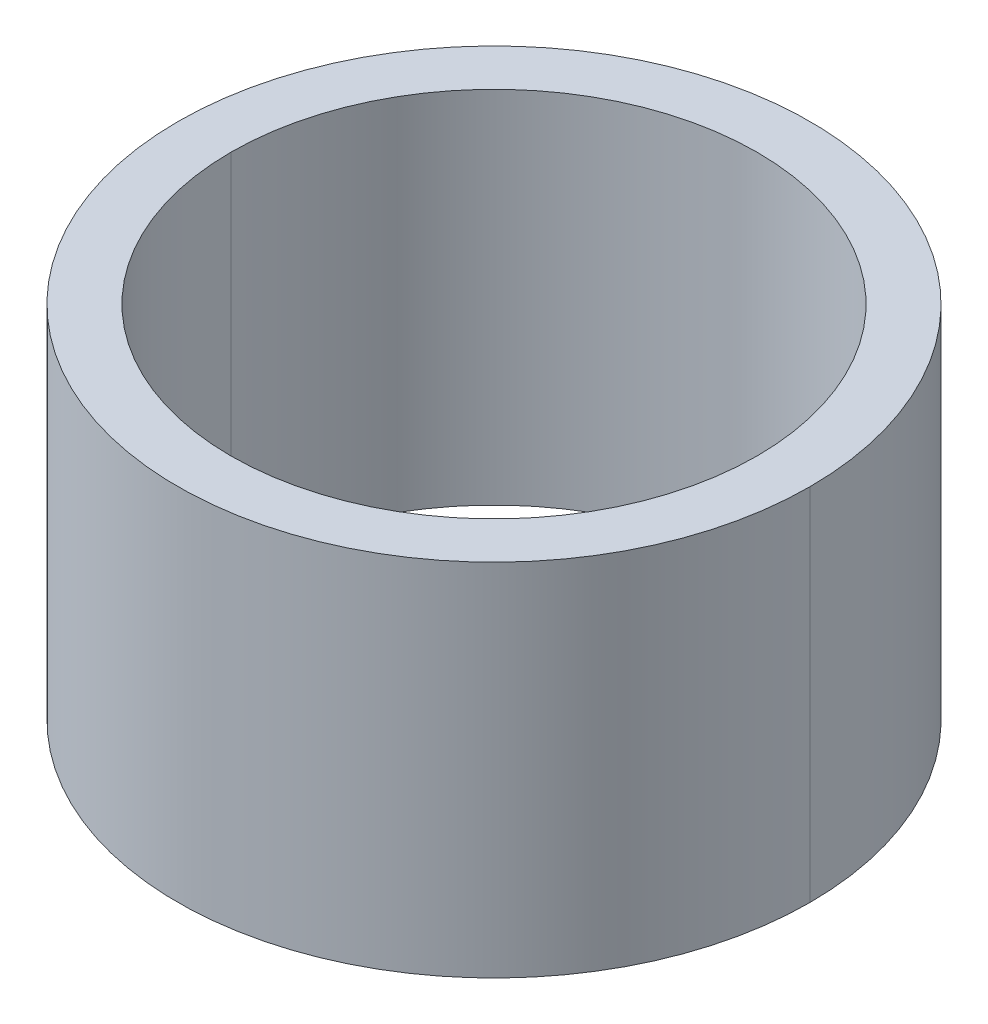
ISO-10303-21;
HEADER;
FILE_DESCRIPTION(('STEP AP214'),'2;1');
FILE_NAME('part.step','',(''),(''),'','','');
FILE_SCHEMA(('AUTOMOTIVE_DESIGN { 1 0 10303 214 1 1 1 1 }'));
ENDSEC;
DATA;
#1=APPLICATION_CONTEXT('core data for automotive mechanical design processes');
#2=APPLICATION_PROTOCOL_DEFINITION('international standard','automotive_design',2000,#1);
#3=PRODUCT_CONTEXT('',#1,'mechanical');
#4=PRODUCT('Part','Part','',(#3));
#5=PRODUCT_RELATED_PRODUCT_CATEGORY('part','',(#4));
#6=PRODUCT_DEFINITION_FORMATION('','',#4);
#7=PRODUCT_DEFINITION_CONTEXT('part definition',#1,'design');
#8=PRODUCT_DEFINITION('design','',#6,#7);
#9=PRODUCT_DEFINITION_SHAPE('','',#8);
#10=(LENGTH_UNIT() NAMED_UNIT(*) SI_UNIT(.MILLI.,.METRE.));
#11=(NAMED_UNIT(*) PLANE_ANGLE_UNIT() SI_UNIT($,.RADIAN.));
#12=(NAMED_UNIT(*) SI_UNIT($,.STERADIAN.) SOLID_ANGLE_UNIT());
#13=UNCERTAINTY_MEASURE_WITH_UNIT(LENGTH_MEASURE(1.E-05),#10,'distance_accuracy_value','');
#14=(GEOMETRIC_REPRESENTATION_CONTEXT(3) GLOBAL_UNCERTAINTY_ASSIGNED_CONTEXT((#13)) GLOBAL_UNIT_ASSIGNED_CONTEXT((#10,
#11,#12)) REPRESENTATION_CONTEXT('',''));
#15=CARTESIAN_POINT('',(0.,0.,0.));
#16=DIRECTION('',(0.,0.,1.));
#17=DIRECTION('',(1.,0.,0.));
#18=AXIS2_PLACEMENT_3D('',#15,#16,#17);
#19=CARTESIAN_POINT('',(94.2227877115227,66.7433443998357,55.5323900599142));
#20=DIRECTION('',(0.,1.,0.));
#21=DIRECTION('',(1.,0.,0.));
#22=AXIS2_PLACEMENT_3D('',#19,#20,#21);
#23=PLANE('',#22);
#24=CARTESIAN_POINT('',(94.2227877115227,66.7433443998357,55.532390059914));
#25=DIRECTION('',(0.,-1.,0.));
#26=DIRECTION('',(1.,0.,0.));
#27=AXIS2_PLACEMENT_3D('',#24,#25,#26);
#28=CIRCLE('',#27,0.803595977519237);
#29=CARTESIAN_POINT('',(93.4191917340035,66.7433443998357,55.532390059914));
#30=VERTEX_POINT('',#29);
#31=CARTESIAN_POINT('',(95.0263836890419,66.7433443998357,55.532390059914));
#32=VERTEX_POINT('',#31);
#33=EDGE_CURVE('E11',#30,#32,#28,.T.);
#34=ORIENTED_EDGE('',*,*,#33,.F.);
#35=CARTESIAN_POINT('',(94.2227877115227,66.7433443998357,55.532390059914));
#36=DIRECTION('',(0.,-1.,0.));
#37=DIRECTION('',(1.,0.,0.));
#38=AXIS2_PLACEMENT_3D('',#35,#36,#37);
#39=CIRCLE('',#38,0.803595977519237);
#40=EDGE_CURVE('E83',#32,#30,#39,.T.);
#41=ORIENTED_EDGE('',*,*,#40,.F.);
#42=EDGE_LOOP('',(#34,#41));
#43=FACE_BOUND('',#42,.T.);
#44=CARTESIAN_POINT('',(94.2227877115227,66.7433443998357,55.5323900599142));
#45=DIRECTION('',(0.,1.,0.));
#46=DIRECTION('',(1.,0.,0.));
#47=AXIS2_PLACEMENT_3D('',#44,#45,#46);
#48=CIRCLE('',#47,0.965609835942224);
#49=CARTESIAN_POINT('',(93.2571778755805,66.7433443998357,55.5323900599142));
#50=VERTEX_POINT('',#49);
#51=CARTESIAN_POINT('',(95.1883975474649,66.7433443998357,55.5323900599142));
#52=VERTEX_POINT('',#51);
#53=EDGE_CURVE('E35',#50,#52,#48,.T.);
#54=ORIENTED_EDGE('',*,*,#53,.F.);
#55=CARTESIAN_POINT('',(94.2227877115227,66.7433443998357,55.5323900599142));
#56=DIRECTION('',(0.,1.,0.));
#57=DIRECTION('',(1.,0.,0.));
#58=AXIS2_PLACEMENT_3D('',#55,#56,#57);
#59=CIRCLE('',#58,0.965609835942224);
#60=EDGE_CURVE('E106',#52,#50,#59,.T.);
#61=ORIENTED_EDGE('',*,*,#60,.F.);
#62=EDGE_LOOP('',(#54,#61));
#63=FACE_BOUND('',#62,.T.);
#64=ADVANCED_FACE('F16',(#43,#63),#23,.F.);
#65=CARTESIAN_POINT('',(94.2227877115227,67.8433443998357,55.5323900599142));
#66=DIRECTION('',(0.,1.,0.));
#67=DIRECTION('',(1.,0.,0.));
#68=AXIS2_PLACEMENT_3D('',#65,#66,#67);
#69=PLANE('',#68);
#70=CARTESIAN_POINT('',(94.2227877115227,67.8433443998357,55.532390059914));
#71=DIRECTION('',(0.,-1.,0.));
#72=DIRECTION('',(0.,0.,1.));
#73=AXIS2_PLACEMENT_3D('',#70,#71,#72);
#74=CIRCLE('',#73,0.803595977519237);
#75=CARTESIAN_POINT('',(93.4191917340035,67.8433443998357,55.532390059914));
#76=VERTEX_POINT('',#75);
#77=CARTESIAN_POINT('',(95.0263836890419,67.8433443998357,55.532390059914));
#78=VERTEX_POINT('',#77);
#79=EDGE_CURVE('E19',#76,#78,#74,.T.);
#80=ORIENTED_EDGE('',*,*,#79,.T.);
#81=CARTESIAN_POINT('',(94.2227877115227,67.8433443998357,55.532390059914));
#82=DIRECTION('',(0.,-1.,0.));
#83=DIRECTION('',(0.,0.,1.));
#84=AXIS2_PLACEMENT_3D('',#81,#82,#83);
#85=CIRCLE('',#84,0.803595977519237);
#86=EDGE_CURVE('E71',#78,#76,#85,.T.);
#87=ORIENTED_EDGE('',*,*,#86,.T.);
#88=EDGE_LOOP('',(#80,#87));
#89=FACE_BOUND('',#88,.T.);
#90=CARTESIAN_POINT('',(94.2227877115227,67.8433443998357,55.5323900599142));
#91=DIRECTION('',(0.,1.,0.));
#92=DIRECTION('',(0.,0.,1.));
#93=AXIS2_PLACEMENT_3D('',#90,#91,#92);
#94=CIRCLE('',#93,0.965609835942231);
#95=CARTESIAN_POINT('',(93.2571778755805,67.8433443998357,55.5323900599142));
#96=VERTEX_POINT('',#95);
#97=CARTESIAN_POINT('',(95.1883975474649,67.8433443998357,55.5323900599142));
#98=VERTEX_POINT('',#97);
#99=EDGE_CURVE('E102',#96,#98,#94,.T.);
#100=ORIENTED_EDGE('',*,*,#99,.T.);
#101=CARTESIAN_POINT('',(94.2227877115227,67.8433443998357,55.5323900599142));
#102=DIRECTION('',(0.,1.,0.));
#103=DIRECTION('',(0.,0.,1.));
#104=AXIS2_PLACEMENT_3D('',#101,#102,#103);
#105=CIRCLE('',#104,0.965609835942231);
#106=EDGE_CURVE('E95',#98,#96,#105,.T.);
#107=ORIENTED_EDGE('',*,*,#106,.T.);
#108=EDGE_LOOP('',(#100,#107));
#109=FACE_BOUND('',#108,.T.);
#110=ADVANCED_FACE('F68',(#89,#109),#69,.T.);
#111=CARTESIAN_POINT('',(94.2227877115227,67.7433443998357,55.532390059914));
#112=DIRECTION('',(0.,-1.,0.));
#113=DIRECTION('',(-1.,0.,0.));
#114=AXIS2_PLACEMENT_3D('',#111,#112,#113);
#115=CYLINDRICAL_SURFACE('',#114,0.803595977519237);
#116=DIRECTION('',(0.,-1.,0.));
#117=VECTOR('',#116,1.);
#118=CARTESIAN_POINT('',(95.0263836890419,67.7433443998357,55.532390059914));
#119=LINE('',#118,#117);
#120=EDGE_CURVE('E77',#78,#32,#119,.T.);
#121=ORIENTED_EDGE('',*,*,#120,.F.);
#122=ORIENTED_EDGE('',*,*,#79,.F.);
#123=DIRECTION('',(0.,-1.,0.));
#124=VECTOR('',#123,1.);
#125=CARTESIAN_POINT('',(93.4191917340035,67.7433443998357,55.532390059914));
#126=LINE('',#125,#124);
#127=EDGE_CURVE('E86',#76,#30,#126,.T.);
#128=ORIENTED_EDGE('',*,*,#127,.T.);
#129=ORIENTED_EDGE('',*,*,#33,.T.);
#130=EDGE_LOOP('',(#121,#122,#128,#129));
#131=FACE_BOUND('',#130,.T.);
#132=ADVANCED_FACE('F78',(#131),#115,.F.);
#133=CARTESIAN_POINT('',(94.2227877115227,67.7433443998357,55.5323900599142));
#134=DIRECTION('',(0.,-1.,0.));
#135=DIRECTION('',(-1.,0.,0.));
#136=AXIS2_PLACEMENT_3D('',#133,#134,#135);
#137=CYLINDRICAL_SURFACE('',#136,0.965609835942224);
#138=DIRECTION('',(0.,-1.,0.));
#139=VECTOR('',#138,1.);
#140=CARTESIAN_POINT('',(95.1883975474649,67.7433443998357,55.5323900599142));
#141=LINE('',#140,#139);
#142=EDGE_CURVE('E99',#98,#52,#141,.T.);
#143=ORIENTED_EDGE('',*,*,#142,.F.);
#144=ORIENTED_EDGE('',*,*,#99,.F.);
#145=DIRECTION('',(0.,-1.,0.));
#146=VECTOR('',#145,1.);
#147=CARTESIAN_POINT('',(93.2571778755805,67.7433443998357,55.5323900599142));
#148=LINE('',#147,#146);
#149=EDGE_CURVE('E109',#96,#50,#148,.T.);
#150=ORIENTED_EDGE('',*,*,#149,.T.);
#151=ORIENTED_EDGE('',*,*,#53,.T.);
#152=EDGE_LOOP('',(#143,#144,#150,#151));
#153=FACE_BOUND('',#152,.T.);
#154=ADVANCED_FACE('F116',(#153),#137,.T.);
#155=CARTESIAN_POINT('',(94.2227877115227,67.7433443998357,55.5323900599142));
#156=DIRECTION('',(0.,-1.,0.));
#157=DIRECTION('',(-1.,0.,0.));
#158=AXIS2_PLACEMENT_3D('',#155,#156,#157);
#159=CYLINDRICAL_SURFACE('',#158,0.965609835942224);
#160=ORIENTED_EDGE('',*,*,#106,.F.);
#161=ORIENTED_EDGE('',*,*,#142,.T.);
#162=ORIENTED_EDGE('',*,*,#60,.T.);
#163=ORIENTED_EDGE('',*,*,#149,.F.);
#164=EDGE_LOOP('',(#160,#161,#162,#163));
#165=FACE_BOUND('',#164,.T.);
#166=ADVANCED_FACE('F118',(#165),#159,.T.);
#167=CARTESIAN_POINT('',(94.2227877115227,67.7433443998357,55.532390059914));
#168=DIRECTION('',(0.,-1.,0.));
#169=DIRECTION('',(-1.,0.,0.));
#170=AXIS2_PLACEMENT_3D('',#167,#168,#169);
#171=CYLINDRICAL_SURFACE('',#170,0.803595977519237);
#172=ORIENTED_EDGE('',*,*,#86,.F.);
#173=ORIENTED_EDGE('',*,*,#120,.T.);
#174=ORIENTED_EDGE('',*,*,#40,.T.);
#175=ORIENTED_EDGE('',*,*,#127,.F.);
#176=EDGE_LOOP('',(#172,#173,#174,#175));
#177=FACE_BOUND('',#176,.T.);
#178=ADVANCED_FACE('F85',(#177),#171,.F.);
#179=CLOSED_SHELL('',(#64,#110,#132,#154,#166,#178));
#180=MANIFOLD_SOLID_BREP('B1',#179);
#181=ADVANCED_BREP_SHAPE_REPRESENTATION('',(#18,#180),#14);
#182=SHAPE_DEFINITION_REPRESENTATION(#9,#181);
ENDSEC;
END-ISO-10303-21;
